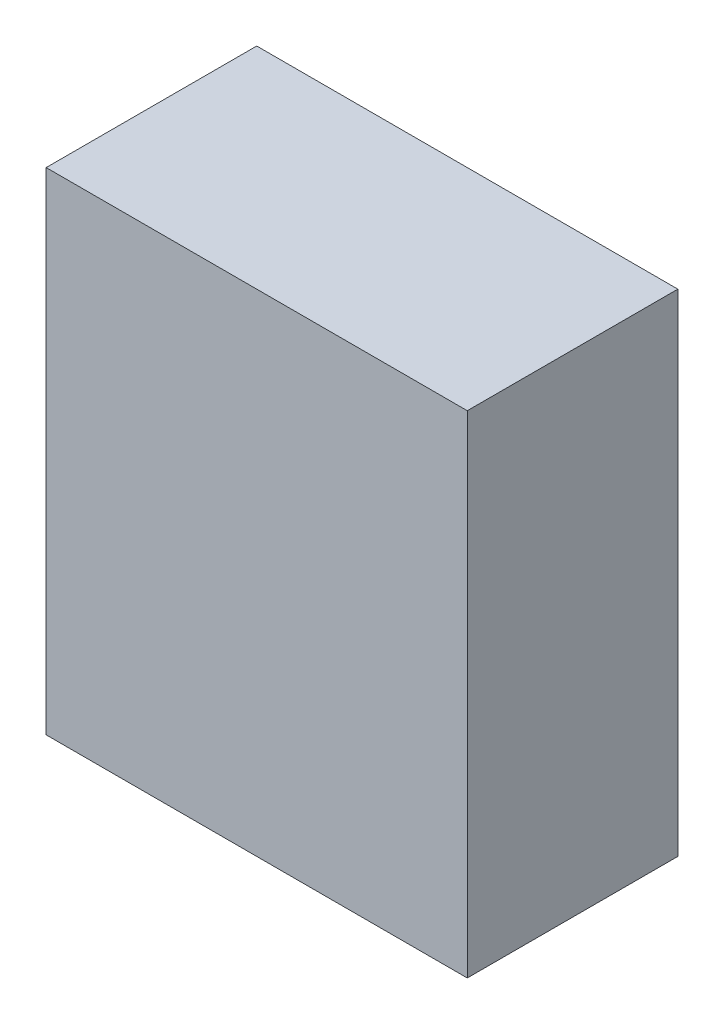
ISO-10303-21;
HEADER;
FILE_DESCRIPTION(('STEP AP214'),'2;1');
FILE_NAME('part.step','',(''),(''),'','','');
FILE_SCHEMA(('AUTOMOTIVE_DESIGN { 1 0 10303 214 1 1 1 1 }'));
ENDSEC;
DATA;
#1=APPLICATION_CONTEXT('core data for automotive mechanical design processes');
#2=APPLICATION_PROTOCOL_DEFINITION('international standard','automotive_design',2000,#1);
#3=PRODUCT_CONTEXT('',#1,'mechanical');
#4=PRODUCT('Part','Part','',(#3));
#5=PRODUCT_RELATED_PRODUCT_CATEGORY('part','',(#4));
#6=PRODUCT_DEFINITION_FORMATION('','',#4);
#7=PRODUCT_DEFINITION_CONTEXT('part definition',#1,'design');
#8=PRODUCT_DEFINITION('design','',#6,#7);
#9=PRODUCT_DEFINITION_SHAPE('','',#8);
#10=(LENGTH_UNIT() NAMED_UNIT(*) SI_UNIT(.MILLI.,.METRE.));
#11=(NAMED_UNIT(*) PLANE_ANGLE_UNIT() SI_UNIT($,.RADIAN.));
#12=(NAMED_UNIT(*) SI_UNIT($,.STERADIAN.) SOLID_ANGLE_UNIT());
#13=UNCERTAINTY_MEASURE_WITH_UNIT(LENGTH_MEASURE(1.E-05),#10,'distance_accuracy_value','');
#14=(GEOMETRIC_REPRESENTATION_CONTEXT(3) GLOBAL_UNCERTAINTY_ASSIGNED_CONTEXT((#13)) GLOBAL_UNIT_ASSIGNED_CONTEXT((#10,
#11,#12)) REPRESENTATION_CONTEXT('',''));
#15=CARTESIAN_POINT('',(0.,0.,0.));
#16=DIRECTION('',(0.,0.,1.));
#17=DIRECTION('',(1.,0.,0.));
#18=AXIS2_PLACEMENT_3D('',#15,#16,#17);
#19=CARTESIAN_POINT('',(-54.6518706549579,3.63854166666667,30.));
#20=DIRECTION('',(1.,0.,0.));
#21=DIRECTION('',(0.,1.,0.));
#22=AXIS2_PLACEMENT_3D('',#19,#20,#21);
#23=PLANE('',#22);
#24=DIRECTION('',(0.,-1.,0.));
#25=VECTOR('',#24,1.);
#26=CARTESIAN_POINT('',(-54.6518706549579,3.63854166666667,0.));
#27=LINE('',#26,#25);
#28=CARTESIAN_POINT('',(-54.6518706549579,3.63854166666667,0.));
#29=VERTEX_POINT('',#28);
#30=CARTESIAN_POINT('',(-54.6518706549579,-66.3614583333333,0.));
#31=VERTEX_POINT('',#30);
#32=EDGE_CURVE('E96',#29,#31,#27,.T.);
#33=ORIENTED_EDGE('',*,*,#32,.T.);
#34=DIRECTION('',(0.,0.,-1.));
#35=VECTOR('',#34,1.);
#36=CARTESIAN_POINT('',(-54.6518706549579,-66.3614583333333,30.));
#37=LINE('',#36,#35);
#38=CARTESIAN_POINT('',(-54.6518706549579,-66.3614583333333,30.));
#39=VERTEX_POINT('',#38);
#40=EDGE_CURVE('E11',#39,#31,#37,.T.);
#41=ORIENTED_EDGE('',*,*,#40,.F.);
#42=DIRECTION('',(0.,-1.,0.));
#43=VECTOR('',#42,1.);
#44=CARTESIAN_POINT('',(-54.6518706549579,3.63854166666667,30.));
#45=LINE('',#44,#43);
#46=CARTESIAN_POINT('',(-54.6518706549579,3.63854166666667,30.));
#47=VERTEX_POINT('',#46);
#48=EDGE_CURVE('E84',#47,#39,#45,.T.);
#49=ORIENTED_EDGE('',*,*,#48,.F.);
#50=DIRECTION('',(0.,0.,-1.));
#51=VECTOR('',#50,1.);
#52=CARTESIAN_POINT('',(-54.6518706549579,3.63854166666667,30.));
#53=LINE('',#52,#51);
#54=EDGE_CURVE('E92',#47,#29,#53,.T.);
#55=ORIENTED_EDGE('',*,*,#54,.T.);
#56=EDGE_LOOP('',(#33,#41,#49,#55));
#57=FACE_BOUND('',#56,.T.);
#58=ADVANCED_FACE('F33',(#57),#23,.F.);
#59=CARTESIAN_POINT('',(-54.6518706549579,-66.3614583333333,30.));
#60=DIRECTION('',(0.,1.,0.));
#61=DIRECTION('',(0.,0.,1.));
#62=AXIS2_PLACEMENT_3D('',#59,#60,#61);
#63=PLANE('',#62);
#64=DIRECTION('',(1.,0.,0.));
#65=VECTOR('',#64,1.);
#66=CARTESIAN_POINT('',(-54.6518706549579,-66.3614583333333,0.));
#67=LINE('',#66,#65);
#68=CARTESIAN_POINT('',(5.34812934504208,-66.3614583333333,0.));
#69=VERTEX_POINT('',#68);
#70=EDGE_CURVE('E88',#31,#69,#67,.T.);
#71=ORIENTED_EDGE('',*,*,#70,.T.);
#72=DIRECTION('',(0.,0.,-1.));
#73=VECTOR('',#72,1.);
#74=CARTESIAN_POINT('',(5.34812934504208,-66.3614583333333,30.));
#75=LINE('',#74,#73);
#76=CARTESIAN_POINT('',(5.34812934504208,-66.3614583333333,30.));
#77=VERTEX_POINT('',#76);
#78=EDGE_CURVE('E41',#77,#69,#75,.T.);
#79=ORIENTED_EDGE('',*,*,#78,.F.);
#80=DIRECTION('',(1.,0.,0.));
#81=VECTOR('',#80,1.);
#82=CARTESIAN_POINT('',(-54.6518706549579,-66.3614583333333,30.));
#83=LINE('',#82,#81);
#84=EDGE_CURVE('E79',#39,#77,#83,.T.);
#85=ORIENTED_EDGE('',*,*,#84,.F.);
#86=ORIENTED_EDGE('',*,*,#40,.T.);
#87=EDGE_LOOP('',(#71,#79,#85,#86));
#88=FACE_BOUND('',#87,.T.);
#89=ADVANCED_FACE('F87',(#88),#63,.F.);
#90=CARTESIAN_POINT('',(5.34812934504208,3.63854166666667,30.));
#91=DIRECTION('',(-1.,0.,0.));
#92=DIRECTION('',(0.,-1.,0.));
#93=AXIS2_PLACEMENT_3D('',#90,#91,#92);
#94=PLANE('',#93);
#95=DIRECTION('',(0.,1.,0.));
#96=VECTOR('',#95,1.);
#97=CARTESIAN_POINT('',(5.34812934504208,3.63854166666667,0.));
#98=LINE('',#97,#96);
#99=CARTESIAN_POINT('',(5.34812934504208,3.63854166666667,0.));
#100=VERTEX_POINT('',#99);
#101=EDGE_CURVE('E66',#69,#100,#98,.T.);
#102=ORIENTED_EDGE('',*,*,#101,.T.);
#103=DIRECTION('',(0.,0.,-1.));
#104=VECTOR('',#103,1.);
#105=CARTESIAN_POINT('',(5.34812934504208,3.63854166666667,30.));
#106=LINE('',#105,#104);
#107=CARTESIAN_POINT('',(5.34812934504208,3.63854166666667,30.));
#108=VERTEX_POINT('',#107);
#109=EDGE_CURVE('E89',#108,#100,#106,.T.);
#110=ORIENTED_EDGE('',*,*,#109,.F.);
#111=DIRECTION('',(0.,1.,0.));
#112=VECTOR('',#111,1.);
#113=CARTESIAN_POINT('',(5.34812934504208,3.63854166666667,30.));
#114=LINE('',#113,#112);
#115=EDGE_CURVE('E82',#77,#108,#114,.T.);
#116=ORIENTED_EDGE('',*,*,#115,.F.);
#117=ORIENTED_EDGE('',*,*,#78,.T.);
#118=EDGE_LOOP('',(#102,#110,#116,#117));
#119=FACE_BOUND('',#118,.T.);
#120=ADVANCED_FACE('F90',(#119),#94,.F.);
#121=CARTESIAN_POINT('',(-54.6518706549579,3.63854166666667,30.));
#122=DIRECTION('',(0.,-1.,0.));
#123=DIRECTION('',(0.,0.,-1.));
#124=AXIS2_PLACEMENT_3D('',#121,#122,#123);
#125=PLANE('',#124);
#126=DIRECTION('',(-1.,0.,0.));
#127=VECTOR('',#126,1.);
#128=CARTESIAN_POINT('',(-54.6518706549579,3.63854166666667,0.));
#129=LINE('',#128,#127);
#130=EDGE_CURVE('E72',#100,#29,#129,.T.);
#131=ORIENTED_EDGE('',*,*,#130,.T.);
#132=ORIENTED_EDGE('',*,*,#54,.F.);
#133=DIRECTION('',(-1.,0.,0.));
#134=VECTOR('',#133,1.);
#135=CARTESIAN_POINT('',(-54.6518706549579,3.63854166666667,30.));
#136=LINE('',#135,#134);
#137=EDGE_CURVE('E49',#108,#47,#136,.T.);
#138=ORIENTED_EDGE('',*,*,#137,.F.);
#139=ORIENTED_EDGE('',*,*,#109,.T.);
#140=EDGE_LOOP('',(#131,#132,#138,#139));
#141=FACE_BOUND('',#140,.T.);
#142=ADVANCED_FACE('F103',(#141),#125,.F.);
#143=CARTESIAN_POINT('',(0.,0.,30.));
#144=DIRECTION('',(0.,0.,1.));
#145=DIRECTION('',(1.,0.,0.));
#146=AXIS2_PLACEMENT_3D('',#143,#144,#145);
#147=PLANE('',#146);
#148=ORIENTED_EDGE('',*,*,#48,.T.);
#149=ORIENTED_EDGE('',*,*,#84,.T.);
#150=ORIENTED_EDGE('',*,*,#115,.T.);
#151=ORIENTED_EDGE('',*,*,#137,.T.);
#152=EDGE_LOOP('',(#148,#149,#150,#151));
#153=FACE_BOUND('',#152,.T.);
#154=ADVANCED_FACE('F80',(#153),#147,.T.);
#155=CARTESIAN_POINT('',(0.,0.,0.));
#156=DIRECTION('',(0.,0.,1.));
#157=DIRECTION('',(1.,0.,0.));
#158=AXIS2_PLACEMENT_3D('',#155,#156,#157);
#159=PLANE('',#158);
#160=ORIENTED_EDGE('',*,*,#32,.F.);
#161=ORIENTED_EDGE('',*,*,#130,.F.);
#162=ORIENTED_EDGE('',*,*,#101,.F.);
#163=ORIENTED_EDGE('',*,*,#70,.F.);
#164=EDGE_LOOP('',(#160,#161,#162,#163));
#165=FACE_BOUND('',#164,.T.);
#166=ADVANCED_FACE('F106',(#165),#159,.F.);
#167=CLOSED_SHELL('',(#58,#89,#120,#142,#154,#166));
#168=MANIFOLD_SOLID_BREP('B2',#167);
#169=ADVANCED_BREP_SHAPE_REPRESENTATION('',(#18,#168),#14);
#170=SHAPE_DEFINITION_REPRESENTATION(#9,#169);
ENDSEC;
END-ISO-10303-21;
